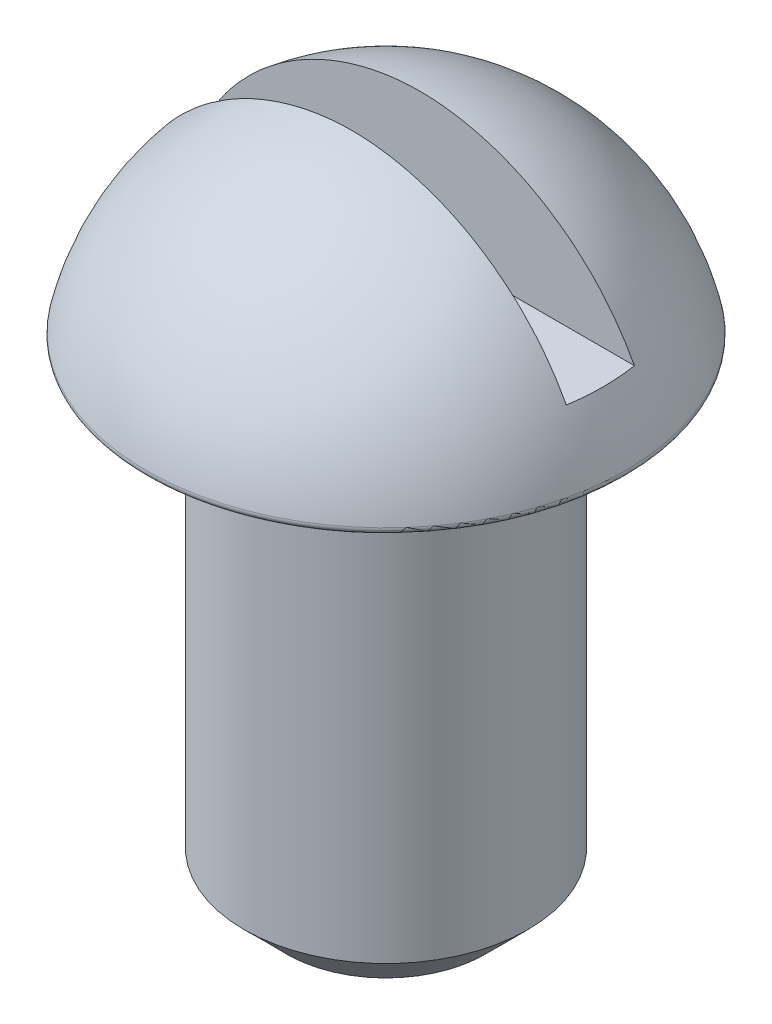
ISO-10303-21;
HEADER;
FILE_DESCRIPTION(('STEP AP214'),'2;1');
FILE_NAME('part.step','',(''),(''),'','','');
FILE_SCHEMA(('AUTOMOTIVE_DESIGN { 1 0 10303 214 1 1 1 1 }'));
ENDSEC;
DATA;
#1=APPLICATION_CONTEXT('core data for automotive mechanical design processes');
#2=APPLICATION_PROTOCOL_DEFINITION('international standard','automotive_design',2000,#1);
#3=PRODUCT_CONTEXT('',#1,'mechanical');
#4=PRODUCT('Part','Part','',(#3));
#5=PRODUCT_RELATED_PRODUCT_CATEGORY('part','',(#4));
#6=PRODUCT_DEFINITION_FORMATION('','',#4);
#7=PRODUCT_DEFINITION_CONTEXT('part definition',#1,'design');
#8=PRODUCT_DEFINITION('design','',#6,#7);
#9=PRODUCT_DEFINITION_SHAPE('','',#8);
#10=(LENGTH_UNIT() NAMED_UNIT(*) SI_UNIT(.MILLI.,.METRE.));
#11=(NAMED_UNIT(*) PLANE_ANGLE_UNIT() SI_UNIT($,.RADIAN.));
#12=(NAMED_UNIT(*) SI_UNIT($,.STERADIAN.) SOLID_ANGLE_UNIT());
#13=UNCERTAINTY_MEASURE_WITH_UNIT(LENGTH_MEASURE(1.E-05),#10,'distance_accuracy_value','');
#14=(GEOMETRIC_REPRESENTATION_CONTEXT(3) GLOBAL_UNCERTAINTY_ASSIGNED_CONTEXT((#13)) GLOBAL_UNIT_ASSIGNED_CONTEXT((#10,
#11,#12)) REPRESENTATION_CONTEXT('',''));
#15=CARTESIAN_POINT('',(0.,0.,0.));
#16=DIRECTION('',(0.,0.,1.));
#17=DIRECTION('',(1.,0.,0.));
#18=AXIS2_PLACEMENT_3D('',#15,#16,#17);
#19=CARTESIAN_POINT('',(0.,89.9002074921607,0.));
#20=DIRECTION('',(0.,1.,0.));
#21=DIRECTION('',(-1.,0.,0.));
#22=AXIS2_PLACEMENT_3D('',#19,#20,#21);
#23=DEGENERATE_TOROIDAL_SURFACE('',#22,0.0672930869706645,4.4,.F.);
#24=CARTESIAN_POINT('',(0.,90.8713853643699,0.));
#25=DIRECTION('',(0.,-1.,0.));
#26=DIRECTION('',(1.,0.,0.));
#27=AXIS2_PLACEMENT_3D('',#24,#25,#26);
#28=CIRCLE('',#27,4.22418842184784);
#29=CARTESIAN_POINT('',(4.22418842184783,90.8713853643699,0.));
#30=VERTEX_POINT('',#29);
#31=EDGE_CURVE('E109',#30,#30,#28,.F.);
#32=ORIENTED_EDGE('',*,*,#31,.T.);
#33=EDGE_LOOP('',(#32));
#34=FACE_BOUND('',#33,.T.);
#35=CARTESIAN_POINT('',(0.,91.9493131400015,0.));
#36=DIRECTION('',(0.,1.,0.));
#37=DIRECTION('',(0.,0.,1.));
#38=AXIS2_PLACEMENT_3D('',#35,#36,#37);
#39=CIRCLE('',#38,3.82644111607745);
#40=CARTESIAN_POINT('',(3.77910725103271,91.9493131400015,0.6));
#41=VERTEX_POINT('',#40);
#42=CARTESIAN_POINT('',(3.77910725103271,91.9493131400015,-0.6));
#43=VERTEX_POINT('',#42);
#44=EDGE_CURVE('E59',#41,#43,#39,.T.);
#45=ORIENTED_EDGE('',*,*,#44,.F.);
#46=CARTESIAN_POINT('',(0.,94.2493131400015,0.6));
#47=CARTESIAN_POINT('',(-0.100916433575558,94.2493103798685,0.6));
#48=CARTESIAN_POINT('',(-0.201845018805938,94.2453802415423,0.6));
#49=CARTESIAN_POINT('',(-0.403183133041554,94.229946137335,0.6));
#50=CARTESIAN_POINT('',(-0.50359207902082,94.2184349922737,0.6));
#51=CARTESIAN_POINT('',(-0.804901863515573,94.1728319890251,0.6));
#52=CARTESIAN_POINT('',(-1.00423722443404,94.1276807120852,0.6));
#53=CARTESIAN_POINT('',(-1.3946859925422,94.0097030270534,0.6));
#54=CARTESIAN_POINT('',(-1.58578827918061,93.936840417719,0.6));
#55=CARTESIAN_POINT('',(-1.98997483575897,93.7491273001042,0.6));
#56=CARTESIAN_POINT('',(-2.20064676402224,93.6290219237657,0.6));
#57=CARTESIAN_POINT('',(-2.59914409211887,93.3555532552457,0.6));
#58=CARTESIAN_POINT('',(-2.78696627004686,93.2021852813705,0.6));
#59=CARTESIAN_POINT('',(-3.13675146742626,92.8643747917515,0.6));
#60=CARTESIAN_POINT('',(-3.29836916194664,92.6795743002121,0.6));
#61=CARTESIAN_POINT('',(-3.58832988194362,92.2854919333813,0.6));
#62=CARTESIAN_POINT('',(-3.71667214865744,92.0762094999985,0.600000000000001));
#63=CARTESIAN_POINT('',(-3.93659713217563,91.6388112389027,0.600000000000001));
#64=CARTESIAN_POINT('',(-4.02813295668809,91.4106718300047,0.600000000000001));
#65=CARTESIAN_POINT('',(-4.1716140782113,90.9422673569034,0.600000000000001));
#66=CARTESIAN_POINT('',(-4.22355949307721,90.7020023287986,0.600000000000001));
#67=CARTESIAN_POINT('',(-4.28639695049151,90.2160983137237,0.600000000000001));
#68=CARTESIAN_POINT('',(-4.29727826451793,89.9704579392329,0.600000000000001));
#69=CARTESIAN_POINT('',(-4.2776490120777,89.4808384545326,0.600000000000001));
#70=CARTESIAN_POINT('',(-4.24713873679716,89.2368593326485,0.600000000000001));
#71=CARTESIAN_POINT('',(-4.14559060248582,88.7574783930793,0.600000000000001));
#72=CARTESIAN_POINT('',(-4.07455151455897,88.5220768357095,0.600000000000001));
#73=CARTESIAN_POINT('',(-3.89395529215663,88.0665319212868,0.600000000000001));
#74=CARTESIAN_POINT('',(-3.78439644856518,87.8463892417871,0.6));
#75=CARTESIAN_POINT('',(-3.52986906947763,87.4276267670297,0.6));
#76=CARTESIAN_POINT('',(-3.38490065222139,87.229006899906,0.6));
#77=CARTESIAN_POINT('',(-3.06369136076642,86.858968410708,0.6));
#78=CARTESIAN_POINT('',(-2.88745593442347,86.6875450598467,0.6));
#79=CARTESIAN_POINT('',(-2.50879402178667,86.3768198596973,0.6));
#80=CARTESIAN_POINT('',(-2.30638138746136,86.2375011295823,0.6));
#81=CARTESIAN_POINT('',(-1.880871090413,85.9948005128464,0.6));
#82=CARTESIAN_POINT('',(-1.65776071073721,85.8914409076849,0.6));
#83=CARTESIAN_POINT('',(-1.19751891926566,85.7238909900771,0.6));
#84=CARTESIAN_POINT('',(-0.960399434647007,85.6596678698002,0.6));
#85=CARTESIAN_POINT('',(-0.478747159521523,85.5729955013838,0.6));
#86=CARTESIAN_POINT('',(-0.234224777339594,85.550490139786,0.6));
#87=CARTESIAN_POINT('',(0.245050852930036,85.5517156748658,0.6));
#88=CARTESIAN_POINT('',(0.479810132903299,85.57366315162,0.6));
#89=CARTESIAN_POINT('',(0.942553746139083,85.6559961767391,0.6));
#90=CARTESIAN_POINT('',(1.17053074114197,85.7164218798982,0.6));
#91=CARTESIAN_POINT('',(1.61295247770061,85.8731337473235,0.6));
#92=CARTESIAN_POINT('',(1.82744028050377,85.9692982344882,0.6));
#93=CARTESIAN_POINT('',(2.2380348671692,86.1948343044822,0.6));
#94=CARTESIAN_POINT('',(2.43414982851232,86.3241910171635,0.6));
#95=CARTESIAN_POINT('',(2.81101749681193,86.6189742284063,0.6));
#96=CARTESIAN_POINT('',(2.99074497464455,86.7857141216827,0.6));
#97=CARTESIAN_POINT('',(3.31977601060451,87.146979398842,0.6));
#98=CARTESIAN_POINT('',(3.46907106029147,87.3415125275011,0.6));
#99=CARTESIAN_POINT('',(3.73327470176273,87.7532988005234,0.6));
#100=CARTESIAN_POINT('',(3.8481053009742,87.9706019973695,0.599999999999999));
#101=CARTESIAN_POINT('',(4.03966323359028,88.4213829563,0.599999999999999));
#102=CARTESIAN_POINT('',(4.11639280022286,88.6548597694807,0.599999999999999));
#103=CARTESIAN_POINT('',(4.22961067835258,89.1314805490181,0.599999999999999));
#104=CARTESIAN_POINT('',(4.26608179494498,89.374628600186,0.599999999999999));
#105=CARTESIAN_POINT('',(4.29768957949924,89.8635984442834,0.599999999999999));
#106=CARTESIAN_POINT('',(4.29282590525974,90.1094202593315,0.599999999999999));
#107=CARTESIAN_POINT('',(4.24189945208102,90.5967767033557,0.599999999999999));
#108=CARTESIAN_POINT('',(4.19583370269803,90.8383110219464,0.599999999999999));
#109=CARTESIAN_POINT('',(4.06380348958764,91.3102250435263,0.599999999999999));
#110=CARTESIAN_POINT('',(3.97783775672956,91.5406043914431,0.599999999999999));
#111=CARTESIAN_POINT('',(3.76844062036168,91.9836665597298,0.599999999999999));
#112=CARTESIAN_POINT('',(3.64500791496203,92.1963487648379,0.6));
#113=CARTESIAN_POINT('',(3.36420426263329,92.5979319462709,0.6));
#114=CARTESIAN_POINT('',(3.2068387719004,92.7868367381418,0.6));
#115=CARTESIAN_POINT('',(2.86268481463257,93.1354568378893,0.6));
#116=CARTESIAN_POINT('',(2.67590976769048,93.2951853874414,0.6));
#117=CARTESIAN_POINT('',(2.27808461271956,93.5810888983144,0.6));
#118=CARTESIAN_POINT('',(2.06701828417455,93.7072412507102,0.6));
#119=CARTESIAN_POINT('',(1.62651009836403,93.9222467148173,0.6));
#120=CARTESIAN_POINT('',(1.39706785424597,94.0110990410371,0.6));
#121=CARTESIAN_POINT('',(1.04461746367771,94.1141470031473,0.6));
#122=CARTESIAN_POINT('',(0.925827359458716,94.1434492787347,0.6));
#123=CARTESIAN_POINT('',(0.686154687851792,94.1917458492544,0.6));
#124=CARTESIAN_POINT('',(0.565272815793726,94.2107435041406,0.6));
#125=CARTESIAN_POINT('',(0.370130186502305,94.232576613117,0.6));
#126=CARTESIAN_POINT('',(0.296234999352834,94.2388300873662,0.6));
#127=CARTESIAN_POINT('',(0.148228677310323,94.247198726766,0.6));
#128=CARTESIAN_POINT('',(0.074117616017995,94.2493151671687,0.6));
#129=CARTESIAN_POINT('',(0.,94.2493131400015,0.6));
#130=B_SPLINE_CURVE_WITH_KNOTS('',3,(#46,#47,#48,#49,#50,#51,#52,#53,#54,#55,#56,#57,#58,#59,
#60,#61,#62,#63,#64,#65,#66,#67,#68,#69,#70,#71,#72,#73,#74,#75,#76,#77,#78,#79,#80,#81,#82,#83,
#84,#85,#86,#87,#88,#89,#90,#91,#92,#93,#94,#95,#96,#97,#98,#99,#100,#101,#102,#103,#104,#105,
#106,#107,#108,#109,#110,#111,#112,#113,#114,#115,#116,#117,#118,#119,#120,#121,#122,#123,#124,
#125,#126,#127,#128,#129),.UNSPECIFIED.,.T.,.F.,(4,2,2,2,2,2,2,2,2,2,2,2,2,2,2,2,2,2,2,2,2,2,2,
2,2,2,2,2,2,2,2,2,2,2,2,2,2,2,2,2,2,4),(0.,0.302690497152907,0.605668053858034,1.21652201869518,
1.8281767409956,2.5522121350477,3.27634950292252,4.00936623410962,4.74239967843746,
5.47636408829094,6.21032631322581,6.94448028191659,7.67862908592687,8.41280015164336,
9.14700379653514,9.88120498980305,10.6152783837962,11.3489649118087,12.0831052498584,
12.8166293137451,13.5491660157951,14.2528959985246,14.9573615802891,15.6594503723522,
16.3612251754797,17.0932206042246,17.8254204078145,18.5592648881205,19.2930663502871,
20.0271811074241,20.7613019421365,21.4954757072037,22.2296728263236,22.9638954600012,
23.6980001228322,24.4317707789596,25.1660342852259,25.9003132533831,26.2670083430854,
26.6335837951607,26.8559620147155,27.078271674752),.UNSPECIFIED.);
#131=CARTESIAN_POINT('',(-3.77910725103272,91.9493131400015,0.6));
#132=VERTEX_POINT('',#131);
#133=EDGE_CURVE('E57',#41,#132,#130,.T.);
#134=ORIENTED_EDGE('',*,*,#133,.T.);
#135=CARTESIAN_POINT('',(-3.77910725103272,91.9493131400015,-0.6));
#136=VERTEX_POINT('',#135);
#137=EDGE_CURVE('E58',#136,#132,#39,.T.);
#138=ORIENTED_EDGE('',*,*,#137,.F.);
#139=CARTESIAN_POINT('',(0.,94.2493131400015,-0.6));
#140=CARTESIAN_POINT('',(0.100916433575544,94.2493103798685,-0.6));
#141=CARTESIAN_POINT('',(0.201845018805924,94.2453802415423,-0.6));
#142=CARTESIAN_POINT('',(0.40318313304154,94.229946137335,-0.6));
#143=CARTESIAN_POINT('',(0.503592079020805,94.2184349922737,-0.6));
#144=CARTESIAN_POINT('',(0.80490186351556,94.1728319890251,-0.6));
#145=CARTESIAN_POINT('',(1.00423722443402,94.1276807120852,-0.6));
#146=CARTESIAN_POINT('',(1.39468599254219,94.0097030270534,-0.6));
#147=CARTESIAN_POINT('',(1.5857882791806,93.936840417719,-0.6));
#148=CARTESIAN_POINT('',(1.98997483575896,93.7491273001042,-0.6));
#149=CARTESIAN_POINT('',(2.20064676402223,93.6290219237657,-0.6));
#150=CARTESIAN_POINT('',(2.59914409211886,93.3555532552457,-0.6));
#151=CARTESIAN_POINT('',(2.78696627004684,93.2021852813705,-0.6));
#152=CARTESIAN_POINT('',(3.13675146742625,92.8643747917515,-0.6));
#153=CARTESIAN_POINT('',(3.29836916194662,92.679574300212,-0.6));
#154=CARTESIAN_POINT('',(3.5883298819436,92.2854919333813,-0.6));
#155=CARTESIAN_POINT('',(3.71667214865742,92.0762094999985,-0.600000000000001));
#156=CARTESIAN_POINT('',(3.93659713217562,91.6388112389027,-0.600000000000001));
#157=CARTESIAN_POINT('',(4.02813295668808,91.4106718300047,-0.600000000000001));
#158=CARTESIAN_POINT('',(4.17161407821129,90.9422673569034,-0.600000000000001));
#159=CARTESIAN_POINT('',(4.2235594930772,90.7020023287986,-0.600000000000001));
#160=CARTESIAN_POINT('',(4.2863969504915,90.2160983137237,-0.600000000000001));
#161=CARTESIAN_POINT('',(4.29727826451792,89.9704579392329,-0.600000000000001));
#162=CARTESIAN_POINT('',(4.27764901207769,89.4808384545326,-0.600000000000001));
#163=CARTESIAN_POINT('',(4.24713873679714,89.2368593326485,-0.600000000000001));
#164=CARTESIAN_POINT('',(4.14559060248581,88.7574783930793,-0.600000000000001));
#165=CARTESIAN_POINT('',(4.07455151455896,88.5220768357095,-0.600000000000001));
#166=CARTESIAN_POINT('',(3.89395529215663,88.0665319212869,-0.600000000000001));
#167=CARTESIAN_POINT('',(3.78439644856517,87.8463892417872,-0.6));
#168=CARTESIAN_POINT('',(3.52986906947761,87.4276267670297,-0.6));
#169=CARTESIAN_POINT('',(3.38490065222138,87.229006899906,-0.6));
#170=CARTESIAN_POINT('',(3.06369136076641,86.858968410708,-0.6));
#171=CARTESIAN_POINT('',(2.88745593442345,86.6875450598467,-0.6));
#172=CARTESIAN_POINT('',(2.50879402178666,86.3768198596973,-0.6));
#173=CARTESIAN_POINT('',(2.30638138746135,86.2375011295823,-0.6));
#174=CARTESIAN_POINT('',(1.88087109041299,85.9948005128464,-0.6));
#175=CARTESIAN_POINT('',(1.6577607107372,85.8914409076849,-0.6));
#176=CARTESIAN_POINT('',(1.19751891926564,85.7238909900771,-0.6));
#177=CARTESIAN_POINT('',(0.960399434646995,85.6596678698002,-0.6));
#178=CARTESIAN_POINT('',(0.478747159521512,85.5729955013838,-0.6));
#179=CARTESIAN_POINT('',(0.234224777339584,85.550490139786,-0.6));
#180=CARTESIAN_POINT('',(-0.245050852930046,85.5517156748658,-0.6));
#181=CARTESIAN_POINT('',(-0.47981013290331,85.57366315162,-0.6));
#182=CARTESIAN_POINT('',(-0.942553746139092,85.6559961767391,-0.6));
#183=CARTESIAN_POINT('',(-1.17053074114197,85.7164218798982,-0.6));
#184=CARTESIAN_POINT('',(-1.61295247770062,85.8731337473235,-0.6));
#185=CARTESIAN_POINT('',(-1.82744028050379,85.9692982344882,-0.6));
#186=CARTESIAN_POINT('',(-2.23803486716921,86.1948343044822,-0.6));
#187=CARTESIAN_POINT('',(-2.43414982851233,86.3241910171635,-0.6));
#188=CARTESIAN_POINT('',(-2.81101749681195,86.6189742284063,-0.6));
#189=CARTESIAN_POINT('',(-2.99074497464457,86.7857141216827,-0.6));
#190=CARTESIAN_POINT('',(-3.31977601060453,87.146979398842,-0.6));
#191=CARTESIAN_POINT('',(-3.46907106029149,87.3415125275011,-0.6));
#192=CARTESIAN_POINT('',(-3.73327470176273,87.7532988005234,-0.6));
#193=CARTESIAN_POINT('',(-3.8481053009742,87.9706019973695,-0.599999999999999));
#194=CARTESIAN_POINT('',(-4.03966323359029,88.4213829562999,-0.599999999999999));
#195=CARTESIAN_POINT('',(-4.11639280022288,88.6548597694807,-0.599999999999999));
#196=CARTESIAN_POINT('',(-4.22961067835259,89.1314805490181,-0.599999999999999));
#197=CARTESIAN_POINT('',(-4.26608179494499,89.374628600186,-0.599999999999999));
#198=CARTESIAN_POINT('',(-4.29768957949925,89.8635984442834,-0.599999999999999));
#199=CARTESIAN_POINT('',(-4.29282590525975,90.1094202593315,-0.599999999999999));
#200=CARTESIAN_POINT('',(-4.24189945208103,90.5967767033557,-0.599999999999999));
#201=CARTESIAN_POINT('',(-4.19583370269804,90.8383110219464,-0.599999999999999));
#202=CARTESIAN_POINT('',(-4.06380348958766,91.3102250435263,-0.599999999999999));
#203=CARTESIAN_POINT('',(-3.97783775672957,91.5406043914431,-0.599999999999999));
#204=CARTESIAN_POINT('',(-3.7684406203617,91.9836665597298,-0.599999999999999));
#205=CARTESIAN_POINT('',(-3.64500791496204,92.1963487648379,-0.6));
#206=CARTESIAN_POINT('',(-3.3642042626333,92.5979319462709,-0.6));
#207=CARTESIAN_POINT('',(-3.20683877190041,92.7868367381418,-0.6));
#208=CARTESIAN_POINT('',(-2.86268481463258,93.1354568378893,-0.6));
#209=CARTESIAN_POINT('',(-2.6759097676905,93.2951853874414,-0.6));
#210=CARTESIAN_POINT('',(-2.27808461271957,93.5810888983144,-0.6));
#211=CARTESIAN_POINT('',(-2.06701828417456,93.7072412507102,-0.6));
#212=CARTESIAN_POINT('',(-1.62651009836404,93.9222467148173,-0.6));
#213=CARTESIAN_POINT('',(-1.39706785424599,94.0110990410371,-0.6));
#214=CARTESIAN_POINT('',(-1.04461746367773,94.1141470031473,-0.6));
#215=CARTESIAN_POINT('',(-0.925827359458732,94.1434492787347,-0.6));
#216=CARTESIAN_POINT('',(-0.686154687851808,94.1917458492544,-0.6));
#217=CARTESIAN_POINT('',(-0.565272815793742,94.2107435041406,-0.6));
#218=CARTESIAN_POINT('',(-0.370130186502321,94.232576613117,-0.6));
#219=CARTESIAN_POINT('',(-0.296234999352851,94.2388300873662,-0.6));
#220=CARTESIAN_POINT('',(-0.148228677310338,94.247198726766,-0.6));
#221=CARTESIAN_POINT('',(-0.07411761601801,94.2493151671687,-0.6));
#222=CARTESIAN_POINT('',(0.,94.2493131400015,-0.6));
#223=B_SPLINE_CURVE_WITH_KNOTS('',3,(#139,#140,#141,#142,#143,#144,#145,#146,#147,#148,#149,
#150,#151,#152,#153,#154,#155,#156,#157,#158,#159,#160,#161,#162,#163,#164,#165,#166,#167,#168,
#169,#170,#171,#172,#173,#174,#175,#176,#177,#178,#179,#180,#181,#182,#183,#184,#185,#186,#187,
#188,#189,#190,#191,#192,#193,#194,#195,#196,#197,#198,#199,#200,#201,#202,#203,#204,#205,#206,
#207,#208,#209,#210,#211,#212,#213,#214,#215,#216,#217,#218,#219,#220,#221,#222),.UNSPECIFIED.,
.T.,.F.,(4,2,2,2,2,2,2,2,2,2,2,2,2,2,2,2,2,2,2,2,2,2,2,2,2,2,2,2,2,2,2,2,2,2,2,2,2,2,2,2,2,4),
(0.,0.302690497152907,0.605668053858034,1.21652201869519,1.82817674099561,2.55221213504771,
3.27634950292252,4.00936623410962,4.74239967843746,5.47636408829094,6.21032631322581,
6.9444802819166,7.67862908592686,8.41280015164333,9.14700379653514,9.88120498980306,
10.6152783837962,11.3489649118087,12.0831052498584,12.8166293137451,13.5491660157951,
14.2528959985246,14.9573615802891,15.6594503723522,16.3612251754797,17.0932206042246,
17.8254204078145,18.5592648881204,19.2930663502871,20.0271811074241,20.7613019421365,
21.4954757072037,22.2296728263236,22.9638954600012,23.6980001228322,24.4317707789596,
25.1660342852259,25.9003132533831,26.2670083430854,26.6335837951607,26.8559620147155,
27.078271674752),.UNSPECIFIED.);
#224=EDGE_CURVE('E51',#136,#43,#223,.T.);
#225=ORIENTED_EDGE('',*,*,#224,.T.);
#226=EDGE_LOOP('',(#45,#134,#138,#225));
#227=FACE_BOUND('',#226,.T.);
#228=ADVANCED_FACE('F29',(#34,#227),#23,.F.);
#229=CARTESIAN_POINT('',(2.5,90.7493131400015,0.));
#230=DIRECTION('',(0.,1.,0.));
#231=DIRECTION('',(-1.,0.,0.));
#232=AXIS2_PLACEMENT_3D('',#229,#230,#231);
#233=PLANE('',#232);
#234=CARTESIAN_POINT('',(0.,90.7493131400015,0.));
#235=DIRECTION('',(0.,1.,0.));
#236=DIRECTION('',(-1.,0.,0.));
#237=AXIS2_PLACEMENT_3D('',#234,#235,#236);
#238=CIRCLE('',#237,4.12665475119287);
#239=CARTESIAN_POINT('',(-4.12665475119288,90.7493131400015,0.));
#240=VERTEX_POINT('',#239);
#241=EDGE_CURVE('E104',#240,#240,#238,.F.);
#242=ORIENTED_EDGE('',*,*,#241,.T.);
#243=EDGE_LOOP('',(#242));
#244=FACE_BOUND('',#243,.T.);
#245=CARTESIAN_POINT('',(0.,90.7493131400015,0.));
#246=DIRECTION('',(0.,1.,0.));
#247=DIRECTION('',(-1.,0.,0.));
#248=AXIS2_PLACEMENT_3D('',#245,#246,#247);
#249=CIRCLE('',#248,2.50000000000001);
#250=CARTESIAN_POINT('',(-2.50000000000002,90.7493131400015,0.));
#251=VERTEX_POINT('',#250);
#252=EDGE_CURVE('E66',#251,#251,#249,.T.);
#253=ORIENTED_EDGE('',*,*,#252,.T.);
#254=EDGE_LOOP('',(#253));
#255=FACE_BOUND('',#254,.T.);
#256=ADVANCED_FACE('F92',(#244,#255),#233,.F.);
#257=CARTESIAN_POINT('',(0.,125.763182897862,0.));
#258=DIRECTION('',(0.,1.,0.));
#259=DIRECTION('',(-1.,0.,0.));
#260=AXIS2_PLACEMENT_3D('',#257,#258,#259);
#261=CYLINDRICAL_SURFACE('',#260,2.50000000000001);
#262=CARTESIAN_POINT('',(0.,82.9993131400015,0.));
#263=DIRECTION('',(0.,1.,0.));
#264=DIRECTION('',(-1.,0.,0.));
#265=AXIS2_PLACEMENT_3D('',#262,#263,#264);
#266=CIRCLE('',#265,2.50000000000001);
#267=CARTESIAN_POINT('',(-2.50000000000002,82.9993131400015,0.));
#268=VERTEX_POINT('',#267);
#269=EDGE_CURVE('E37',#268,#268,#266,.T.);
#270=ORIENTED_EDGE('',*,*,#269,.T.);
#271=EDGE_LOOP('',(#270));
#272=FACE_BOUND('',#271,.T.);
#273=ORIENTED_EDGE('',*,*,#252,.F.);
#274=EDGE_LOOP('',(#273));
#275=FACE_BOUND('',#274,.T.);
#276=ADVANCED_FACE('F89',(#272,#275),#261,.T.);
#277=CARTESIAN_POINT('',(2.50000000000001,82.2493131400015,0.));
#278=DIRECTION('',(0.,1.,0.));
#279=DIRECTION('',(-1.,0.,0.));
#280=AXIS2_PLACEMENT_3D('',#277,#278,#279);
#281=PLANE('',#280);
#282=CARTESIAN_POINT('',(0.,82.2493131400015,0.));
#283=DIRECTION('',(0.,1.,0.));
#284=DIRECTION('',(-1.,0.,0.));
#285=AXIS2_PLACEMENT_3D('',#282,#283,#284);
#286=CIRCLE('',#285,1.75);
#287=CARTESIAN_POINT('',(-1.75000000000001,82.2493131400015,0.));
#288=VERTEX_POINT('',#287);
#289=EDGE_CURVE('E11',#288,#288,#286,.F.);
#290=ORIENTED_EDGE('',*,*,#289,.T.);
#291=EDGE_LOOP('',(#290));
#292=FACE_BOUND('',#291,.T.);
#293=ADVANCED_FACE('F86',(#292),#281,.F.);
#294=CARTESIAN_POINT('',(-4.25000000000001,91.9493131400015,0.600000000000001));
#295=DIRECTION('',(0.,1.,0.));
#296=DIRECTION('',(0.,0.,1.));
#297=AXIS2_PLACEMENT_3D('',#294,#295,#296);
#298=PLANE('',#297);
#299=ORIENTED_EDGE('',*,*,#44,.T.);
#300=DIRECTION('',(-1.,0.,0.));
#301=VECTOR('',#300,1.);
#302=CARTESIAN_POINT('',(-4.25000000000001,91.9493131400015,-0.599999999999999));
#303=LINE('',#302,#301);
#304=EDGE_CURVE('E44',#43,#136,#303,.T.);
#305=ORIENTED_EDGE('',*,*,#304,.T.);
#306=ORIENTED_EDGE('',*,*,#137,.T.);
#307=DIRECTION('',(1.,0.,0.));
#308=VECTOR('',#307,1.);
#309=CARTESIAN_POINT('',(-4.25000000000001,91.9493131400015,0.600000000000001));
#310=LINE('',#309,#308);
#311=EDGE_CURVE('E65',#132,#41,#310,.T.);
#312=ORIENTED_EDGE('',*,*,#311,.T.);
#313=EDGE_LOOP('',(#299,#305,#306,#312));
#314=FACE_BOUND('',#313,.T.);
#315=ADVANCED_FACE('F64',(#314),#298,.T.);
#316=CARTESIAN_POINT('',(-4.25000000000001,91.9493131400015,-0.599999999999999));
#317=DIRECTION('',(0.,0.,-1.));
#318=DIRECTION('',(-1.,0.,0.));
#319=AXIS2_PLACEMENT_3D('',#316,#317,#318);
#320=PLANE('',#319);
#321=ORIENTED_EDGE('',*,*,#224,.F.);
#322=ORIENTED_EDGE('',*,*,#304,.F.);
#323=EDGE_LOOP('',(#321,#322));
#324=FACE_BOUND('',#323,.T.);
#325=ADVANCED_FACE('F83',(#324),#320,.F.);
#326=CARTESIAN_POINT('',(-4.25000000000001,91.9493131400015,0.600000000000001));
#327=DIRECTION('',(0.,0.,1.));
#328=DIRECTION('',(1.,0.,0.));
#329=AXIS2_PLACEMENT_3D('',#326,#327,#328);
#330=PLANE('',#329);
#331=ORIENTED_EDGE('',*,*,#133,.F.);
#332=ORIENTED_EDGE('',*,*,#311,.F.);
#333=EDGE_LOOP('',(#331,#332));
#334=FACE_BOUND('',#333,.T.);
#335=ADVANCED_FACE('F68',(#334),#330,.F.);
#336=CARTESIAN_POINT('',(0.,90.8493131400015,0.));
#337=DIRECTION('',(0.,1.,0.));
#338=DIRECTION('',(-1.,0.,0.));
#339=AXIS2_PLACEMENT_3D('',#336,#337,#338);
#340=TOROIDAL_SURFACE('',#339,4.12665475119287,0.1);
#341=ORIENTED_EDGE('',*,*,#241,.F.);
#342=EDGE_LOOP('',(#341));
#343=FACE_BOUND('',#342,.T.);
#344=ORIENTED_EDGE('',*,*,#31,.F.);
#345=EDGE_LOOP('',(#344));
#346=FACE_BOUND('',#345,.T.);
#347=ADVANCED_FACE('F82',(#343,#346),#340,.T.);
#348=CARTESIAN_POINT('',(0.,82.9993131400015,0.));
#349=DIRECTION('',(0.,1.,0.));
#350=DIRECTION('',(-1.,0.,0.));
#351=AXIS2_PLACEMENT_3D('',#348,#349,#350);
#352=CONICAL_SURFACE('',#351,2.50000000000001,0.785398163397454);
#353=ORIENTED_EDGE('',*,*,#289,.F.);
#354=EDGE_LOOP('',(#353));
#355=FACE_BOUND('',#354,.T.);
#356=ORIENTED_EDGE('',*,*,#269,.F.);
#357=EDGE_LOOP('',(#356));
#358=FACE_BOUND('',#357,.T.);
#359=ADVANCED_FACE('F115',(#355,#358),#352,.T.);
#360=CLOSED_SHELL('',(#228,#256,#276,#293,#315,#325,#335,#347,#359));
#361=MANIFOLD_SOLID_BREP('B2',#360);
#362=ADVANCED_BREP_SHAPE_REPRESENTATION('',(#18,#361),#14);
#363=SHAPE_DEFINITION_REPRESENTATION(#9,#362);
ENDSEC;
END-ISO-10303-21;
